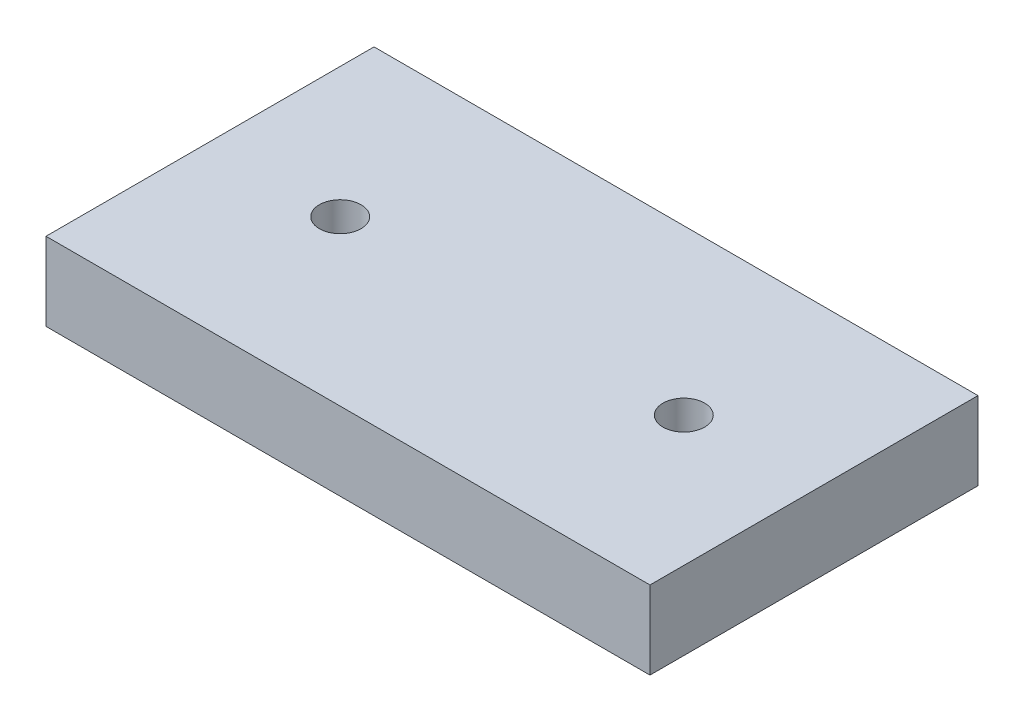
ISO-10303-21;
HEADER;
FILE_DESCRIPTION(('STEP AP214'),'2;1');
FILE_NAME('part.step','',(''),(''),'','','');
FILE_SCHEMA(('AUTOMOTIVE_DESIGN { 1 0 10303 214 1 1 1 1 }'));
ENDSEC;
DATA;
#1=APPLICATION_CONTEXT('core data for automotive mechanical design processes');
#2=APPLICATION_PROTOCOL_DEFINITION('international standard','automotive_design',2000,#1);
#3=PRODUCT_CONTEXT('',#1,'mechanical');
#4=PRODUCT('Part','Part','',(#3));
#5=PRODUCT_RELATED_PRODUCT_CATEGORY('part','',(#4));
#6=PRODUCT_DEFINITION_FORMATION('','',#4);
#7=PRODUCT_DEFINITION_CONTEXT('part definition',#1,'design');
#8=PRODUCT_DEFINITION('design','',#6,#7);
#9=PRODUCT_DEFINITION_SHAPE('','',#8);
#10=(LENGTH_UNIT() NAMED_UNIT(*) SI_UNIT(.MILLI.,.METRE.));
#11=(NAMED_UNIT(*) PLANE_ANGLE_UNIT() SI_UNIT($,.RADIAN.));
#12=(NAMED_UNIT(*) SI_UNIT($,.STERADIAN.) SOLID_ANGLE_UNIT());
#13=UNCERTAINTY_MEASURE_WITH_UNIT(LENGTH_MEASURE(1.E-05),#10,'distance_accuracy_value','');
#14=(GEOMETRIC_REPRESENTATION_CONTEXT(3) GLOBAL_UNCERTAINTY_ASSIGNED_CONTEXT((#13)) GLOBAL_UNIT_ASSIGNED_CONTEXT((#10,
#11,#12)) REPRESENTATION_CONTEXT('',''));
#15=CARTESIAN_POINT('',(0.,0.,0.));
#16=DIRECTION('',(0.,0.,1.));
#17=DIRECTION('',(1.,0.,0.));
#18=AXIS2_PLACEMENT_3D('',#15,#16,#17);
#19=CARTESIAN_POINT('',(0.,15.,0.));
#20=DIRECTION('',(0.,-1.,0.));
#21=DIRECTION('',(0.,0.,-1.));
#22=AXIS2_PLACEMENT_3D('',#19,#20,#21);
#23=PLANE('',#22);
#24=CARTESIAN_POINT('',(25.,15.,-31.5));
#25=DIRECTION('',(0.,1.,0.));
#26=DIRECTION('',(0.,0.,1.));
#27=AXIS2_PLACEMENT_3D('',#24,#25,#26);
#28=CIRCLE('',#27,3.99999999999999);
#29=CARTESIAN_POINT('',(25.,15.,-27.5));
#30=VERTEX_POINT('',#29);
#31=EDGE_CURVE('E100',#30,#30,#28,.T.);
#32=ORIENTED_EDGE('',*,*,#31,.F.);
#33=EDGE_LOOP('',(#32));
#34=FACE_BOUND('',#33,.T.);
#35=DIRECTION('',(0.,0.,1.));
#36=VECTOR('',#35,1.);
#37=CARTESIAN_POINT('',(0.,15.,0.));
#38=LINE('',#37,#36);
#39=CARTESIAN_POINT('',(0.,15.,-63.));
#40=VERTEX_POINT('',#39);
#41=CARTESIAN_POINT('',(0.,15.,0.));
#42=VERTEX_POINT('',#41);
#43=EDGE_CURVE('E85',#40,#42,#38,.T.);
#44=ORIENTED_EDGE('',*,*,#43,.T.);
#45=DIRECTION('',(1.,0.,0.));
#46=VECTOR('',#45,1.);
#47=CARTESIAN_POINT('',(0.,15.,0.));
#48=LINE('',#47,#46);
#49=CARTESIAN_POINT('',(116.,15.,0.));
#50=VERTEX_POINT('',#49);
#51=EDGE_CURVE('E80',#42,#50,#48,.T.);
#52=ORIENTED_EDGE('',*,*,#51,.T.);
#53=DIRECTION('',(0.,0.,-1.));
#54=VECTOR('',#53,1.);
#55=CARTESIAN_POINT('',(116.,15.,0.));
#56=LINE('',#55,#54);
#57=CARTESIAN_POINT('',(116.,15.,-63.));
#58=VERTEX_POINT('',#57);
#59=EDGE_CURVE('E83',#50,#58,#56,.T.);
#60=ORIENTED_EDGE('',*,*,#59,.T.);
#61=DIRECTION('',(-1.,0.,0.));
#62=VECTOR('',#61,1.);
#63=CARTESIAN_POINT('',(0.,15.,-63.));
#64=LINE('',#63,#62);
#65=EDGE_CURVE('E50',#58,#40,#64,.T.);
#66=ORIENTED_EDGE('',*,*,#65,.T.);
#67=EDGE_LOOP('',(#44,#52,#60,#66));
#68=FACE_BOUND('',#67,.T.);
#69=CARTESIAN_POINT('',(91.,15.,-31.5));
#70=DIRECTION('',(0.,1.,0.));
#71=DIRECTION('',(0.,0.,1.));
#72=AXIS2_PLACEMENT_3D('',#69,#70,#71);
#73=CIRCLE('',#72,4.00000000000001);
#74=CARTESIAN_POINT('',(91.,15.,-27.5));
#75=VERTEX_POINT('',#74);
#76=EDGE_CURVE('E115',#75,#75,#73,.T.);
#77=ORIENTED_EDGE('',*,*,#76,.F.);
#78=EDGE_LOOP('',(#77));
#79=FACE_BOUND('',#78,.T.);
#80=ADVANCED_FACE('F33',(#34,#68,#79),#23,.F.);
#81=CARTESIAN_POINT('',(0.,0.,0.));
#82=DIRECTION('',(0.,-1.,0.));
#83=DIRECTION('',(0.,0.,-1.));
#84=AXIS2_PLACEMENT_3D('',#81,#82,#83);
#85=PLANE('',#84);
#86=CARTESIAN_POINT('',(25.,0.,-31.5));
#87=DIRECTION('',(0.,1.,0.));
#88=DIRECTION('',(0.,0.,1.));
#89=AXIS2_PLACEMENT_3D('',#86,#87,#88);
#90=CIRCLE('',#89,3.99999999999999);
#91=CARTESIAN_POINT('',(25.,0.,-27.5));
#92=VERTEX_POINT('',#91);
#93=EDGE_CURVE('E112',#92,#92,#90,.T.);
#94=ORIENTED_EDGE('',*,*,#93,.T.);
#95=EDGE_LOOP('',(#94));
#96=FACE_BOUND('',#95,.T.);
#97=DIRECTION('',(0.,0.,1.));
#98=VECTOR('',#97,1.);
#99=CARTESIAN_POINT('',(0.,0.,0.));
#100=LINE('',#99,#98);
#101=CARTESIAN_POINT('',(0.,0.,-63.));
#102=VERTEX_POINT('',#101);
#103=CARTESIAN_POINT('',(0.,0.,0.));
#104=VERTEX_POINT('',#103);
#105=EDGE_CURVE('E97',#102,#104,#100,.T.);
#106=ORIENTED_EDGE('',*,*,#105,.F.);
#107=DIRECTION('',(-1.,0.,0.));
#108=VECTOR('',#107,1.);
#109=CARTESIAN_POINT('',(0.,0.,-63.));
#110=LINE('',#109,#108);
#111=CARTESIAN_POINT('',(116.,0.,-63.));
#112=VERTEX_POINT('',#111);
#113=EDGE_CURVE('E73',#112,#102,#110,.T.);
#114=ORIENTED_EDGE('',*,*,#113,.F.);
#115=DIRECTION('',(0.,0.,-1.));
#116=VECTOR('',#115,1.);
#117=CARTESIAN_POINT('',(116.,0.,0.));
#118=LINE('',#117,#116);
#119=CARTESIAN_POINT('',(116.,0.,0.));
#120=VERTEX_POINT('',#119);
#121=EDGE_CURVE('E67',#120,#112,#118,.T.);
#122=ORIENTED_EDGE('',*,*,#121,.F.);
#123=DIRECTION('',(1.,0.,0.));
#124=VECTOR('',#123,1.);
#125=CARTESIAN_POINT('',(0.,0.,0.));
#126=LINE('',#125,#124);
#127=EDGE_CURVE('E89',#104,#120,#126,.T.);
#128=ORIENTED_EDGE('',*,*,#127,.F.);
#129=EDGE_LOOP('',(#106,#114,#122,#128));
#130=FACE_BOUND('',#129,.T.);
#131=CARTESIAN_POINT('',(91.,0.,-31.5));
#132=DIRECTION('',(0.,1.,0.));
#133=DIRECTION('',(0.,0.,1.));
#134=AXIS2_PLACEMENT_3D('',#131,#132,#133);
#135=CIRCLE('',#134,4.00000000000001);
#136=CARTESIAN_POINT('',(91.,0.,-27.5));
#137=VERTEX_POINT('',#136);
#138=EDGE_CURVE('E118',#137,#137,#135,.T.);
#139=ORIENTED_EDGE('',*,*,#138,.T.);
#140=EDGE_LOOP('',(#139));
#141=FACE_BOUND('',#140,.T.);
#142=ADVANCED_FACE('F108',(#96,#130,#141),#85,.T.);
#143=CARTESIAN_POINT('',(0.,15.,0.));
#144=DIRECTION('',(1.,0.,0.));
#145=DIRECTION('',(0.,0.,-1.));
#146=AXIS2_PLACEMENT_3D('',#143,#144,#145);
#147=PLANE('',#146);
#148=ORIENTED_EDGE('',*,*,#105,.T.);
#149=DIRECTION('',(0.,-1.,0.));
#150=VECTOR('',#149,1.);
#151=CARTESIAN_POINT('',(0.,15.,0.));
#152=LINE('',#151,#150);
#153=EDGE_CURVE('E11',#42,#104,#152,.T.);
#154=ORIENTED_EDGE('',*,*,#153,.F.);
#155=ORIENTED_EDGE('',*,*,#43,.F.);
#156=DIRECTION('',(0.,-1.,0.));
#157=VECTOR('',#156,1.);
#158=CARTESIAN_POINT('',(0.,15.,-63.));
#159=LINE('',#158,#157);
#160=EDGE_CURVE('E93',#40,#102,#159,.T.);
#161=ORIENTED_EDGE('',*,*,#160,.T.);
#162=EDGE_LOOP('',(#148,#154,#155,#161));
#163=FACE_BOUND('',#162,.T.);
#164=ADVANCED_FACE('F35',(#163),#147,.F.);
#165=CARTESIAN_POINT('',(0.,15.,0.));
#166=DIRECTION('',(0.,0.,-1.));
#167=DIRECTION('',(-1.,0.,0.));
#168=AXIS2_PLACEMENT_3D('',#165,#166,#167);
#169=PLANE('',#168);
#170=ORIENTED_EDGE('',*,*,#127,.T.);
#171=DIRECTION('',(0.,-1.,0.));
#172=VECTOR('',#171,1.);
#173=CARTESIAN_POINT('',(116.,15.,0.));
#174=LINE('',#173,#172);
#175=EDGE_CURVE('E42',#50,#120,#174,.T.);
#176=ORIENTED_EDGE('',*,*,#175,.F.);
#177=ORIENTED_EDGE('',*,*,#51,.F.);
#178=ORIENTED_EDGE('',*,*,#153,.T.);
#179=EDGE_LOOP('',(#170,#176,#177,#178));
#180=FACE_BOUND('',#179,.T.);
#181=ADVANCED_FACE('F88',(#180),#169,.F.);
#182=CARTESIAN_POINT('',(116.,15.,0.));
#183=DIRECTION('',(-1.,0.,0.));
#184=DIRECTION('',(0.,0.,1.));
#185=AXIS2_PLACEMENT_3D('',#182,#183,#184);
#186=PLANE('',#185);
#187=ORIENTED_EDGE('',*,*,#121,.T.);
#188=DIRECTION('',(0.,-1.,0.));
#189=VECTOR('',#188,1.);
#190=CARTESIAN_POINT('',(116.,15.,-63.));
#191=LINE('',#190,#189);
#192=EDGE_CURVE('E90',#58,#112,#191,.T.);
#193=ORIENTED_EDGE('',*,*,#192,.F.);
#194=ORIENTED_EDGE('',*,*,#59,.F.);
#195=ORIENTED_EDGE('',*,*,#175,.T.);
#196=EDGE_LOOP('',(#187,#193,#194,#195));
#197=FACE_BOUND('',#196,.T.);
#198=ADVANCED_FACE('F91',(#197),#186,.F.);
#199=CARTESIAN_POINT('',(0.,15.,-63.));
#200=DIRECTION('',(0.,0.,1.));
#201=DIRECTION('',(1.,0.,0.));
#202=AXIS2_PLACEMENT_3D('',#199,#200,#201);
#203=PLANE('',#202);
#204=ORIENTED_EDGE('',*,*,#113,.T.);
#205=ORIENTED_EDGE('',*,*,#160,.F.);
#206=ORIENTED_EDGE('',*,*,#65,.F.);
#207=ORIENTED_EDGE('',*,*,#192,.T.);
#208=EDGE_LOOP('',(#204,#205,#206,#207));
#209=FACE_BOUND('',#208,.T.);
#210=ADVANCED_FACE('F105',(#209),#203,.F.);
#211=CARTESIAN_POINT('',(25.,15.,-31.5));
#212=DIRECTION('',(0.,-1.,0.));
#213=DIRECTION('',(0.,0.,-1.));
#214=AXIS2_PLACEMENT_3D('',#211,#212,#213);
#215=CYLINDRICAL_SURFACE('',#214,3.99999999999999);
#216=ORIENTED_EDGE('',*,*,#31,.T.);
#217=EDGE_LOOP('',(#216));
#218=FACE_BOUND('',#217,.T.);
#219=ORIENTED_EDGE('',*,*,#93,.F.);
#220=EDGE_LOOP('',(#219));
#221=FACE_BOUND('',#220,.T.);
#222=ADVANCED_FACE('F136',(#218,#221),#215,.F.);
#223=CARTESIAN_POINT('',(91.,15.,-31.5));
#224=DIRECTION('',(0.,-1.,0.));
#225=DIRECTION('',(0.,0.,-1.));
#226=AXIS2_PLACEMENT_3D('',#223,#224,#225);
#227=CYLINDRICAL_SURFACE('',#226,4.00000000000001);
#228=ORIENTED_EDGE('',*,*,#76,.T.);
#229=EDGE_LOOP('',(#228));
#230=FACE_BOUND('',#229,.T.);
#231=ORIENTED_EDGE('',*,*,#138,.F.);
#232=EDGE_LOOP('',(#231));
#233=FACE_BOUND('',#232,.T.);
#234=ADVANCED_FACE('F124',(#230,#233),#227,.F.);
#235=CLOSED_SHELL('',(#80,#142,#164,#181,#198,#210,#222,#234));
#236=MANIFOLD_SOLID_BREP('B2',#235);
#237=ADVANCED_BREP_SHAPE_REPRESENTATION('',(#18,#236),#14);
#238=SHAPE_DEFINITION_REPRESENTATION(#9,#237);
ENDSEC;
END-ISO-10303-21;
